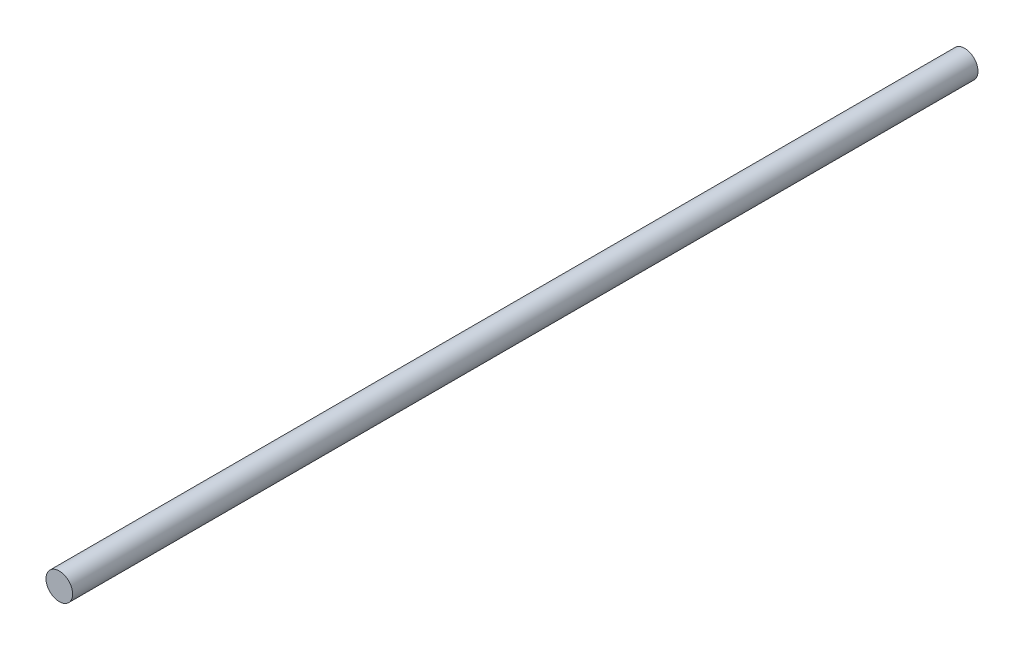
ISO-10303-21;
HEADER;
FILE_DESCRIPTION(('STEP AP214'),'2;1');
FILE_NAME('part.step','',(''),(''),'','','');
FILE_SCHEMA(('AUTOMOTIVE_DESIGN { 1 0 10303 214 1 1 1 1 }'));
ENDSEC;
DATA;
#1=APPLICATION_CONTEXT('core data for automotive mechanical design processes');
#2=APPLICATION_PROTOCOL_DEFINITION('international standard','automotive_design',2000,#1);
#3=PRODUCT_CONTEXT('',#1,'mechanical');
#4=PRODUCT('Part','Part','',(#3));
#5=PRODUCT_RELATED_PRODUCT_CATEGORY('part','',(#4));
#6=PRODUCT_DEFINITION_FORMATION('','',#4);
#7=PRODUCT_DEFINITION_CONTEXT('part definition',#1,'design');
#8=PRODUCT_DEFINITION('design','',#6,#7);
#9=PRODUCT_DEFINITION_SHAPE('','',#8);
#10=(LENGTH_UNIT() NAMED_UNIT(*) SI_UNIT(.MILLI.,.METRE.));
#11=(NAMED_UNIT(*) PLANE_ANGLE_UNIT() SI_UNIT($,.RADIAN.));
#12=(NAMED_UNIT(*) SI_UNIT($,.STERADIAN.) SOLID_ANGLE_UNIT());
#13=UNCERTAINTY_MEASURE_WITH_UNIT(LENGTH_MEASURE(1.E-05),#10,'distance_accuracy_value','');
#14=(GEOMETRIC_REPRESENTATION_CONTEXT(3) GLOBAL_UNCERTAINTY_ASSIGNED_CONTEXT((#13)) GLOBAL_UNIT_ASSIGNED_CONTEXT((#10,
#11,#12)) REPRESENTATION_CONTEXT('',''));
#15=CARTESIAN_POINT('',(0.,0.,0.));
#16=DIRECTION('',(0.,0.,1.));
#17=DIRECTION('',(1.,0.,0.));
#18=AXIS2_PLACEMENT_3D('',#15,#16,#17);
#19=CARTESIAN_POINT('',(0.,0.,204.));
#20=DIRECTION('',(0.,0.,-1.));
#21=DIRECTION('',(-1.,0.,0.));
#22=AXIS2_PLACEMENT_3D('',#19,#20,#21);
#23=CYLINDRICAL_SURFACE('',#22,3.);
#24=CARTESIAN_POINT('',(0.,0.,204.));
#25=DIRECTION('',(0.,0.,1.));
#26=DIRECTION('',(1.,0.,0.));
#27=AXIS2_PLACEMENT_3D('',#24,#25,#26);
#28=CIRCLE('',#27,3.);
#29=CARTESIAN_POINT('',(3.,0.,204.));
#30=VERTEX_POINT('',#29);
#31=EDGE_CURVE('E10',#30,#30,#28,.T.);
#32=ORIENTED_EDGE('',*,*,#31,.F.);
#33=EDGE_LOOP('',(#32));
#34=FACE_BOUND('',#33,.T.);
#35=CARTESIAN_POINT('',(0.,0.,0.));
#36=DIRECTION('',(0.,0.,1.));
#37=DIRECTION('',(1.,0.,0.));
#38=AXIS2_PLACEMENT_3D('',#35,#36,#37);
#39=CIRCLE('',#38,3.);
#40=CARTESIAN_POINT('',(3.,0.,0.));
#41=VERTEX_POINT('',#40);
#42=EDGE_CURVE('E33',#41,#41,#39,.T.);
#43=ORIENTED_EDGE('',*,*,#42,.T.);
#44=EDGE_LOOP('',(#43));
#45=FACE_BOUND('',#44,.T.);
#46=ADVANCED_FACE('F30',(#34,#45),#23,.T.);
#47=CARTESIAN_POINT('',(0.,0.,204.));
#48=DIRECTION('',(0.,0.,1.));
#49=DIRECTION('',(1.,0.,0.));
#50=AXIS2_PLACEMENT_3D('',#47,#48,#49);
#51=PLANE('',#50);
#52=ORIENTED_EDGE('',*,*,#31,.T.);
#53=EDGE_LOOP('',(#52));
#54=FACE_BOUND('',#53,.T.);
#55=ADVANCED_FACE('F45',(#54),#51,.T.);
#56=CARTESIAN_POINT('',(0.,0.,0.));
#57=DIRECTION('',(0.,0.,1.));
#58=DIRECTION('',(1.,0.,0.));
#59=AXIS2_PLACEMENT_3D('',#56,#57,#58);
#60=PLANE('',#59);
#61=ORIENTED_EDGE('',*,*,#42,.F.);
#62=EDGE_LOOP('',(#61));
#63=FACE_BOUND('',#62,.T.);
#64=ADVANCED_FACE('F43',(#63),#60,.F.);
#65=CLOSED_SHELL('',(#46,#55,#64));
#66=MANIFOLD_SOLID_BREP('B2',#65);
#67=ADVANCED_BREP_SHAPE_REPRESENTATION('',(#18,#66),#14);
#68=SHAPE_DEFINITION_REPRESENTATION(#9,#67);
ENDSEC;
END-ISO-10303-21;
